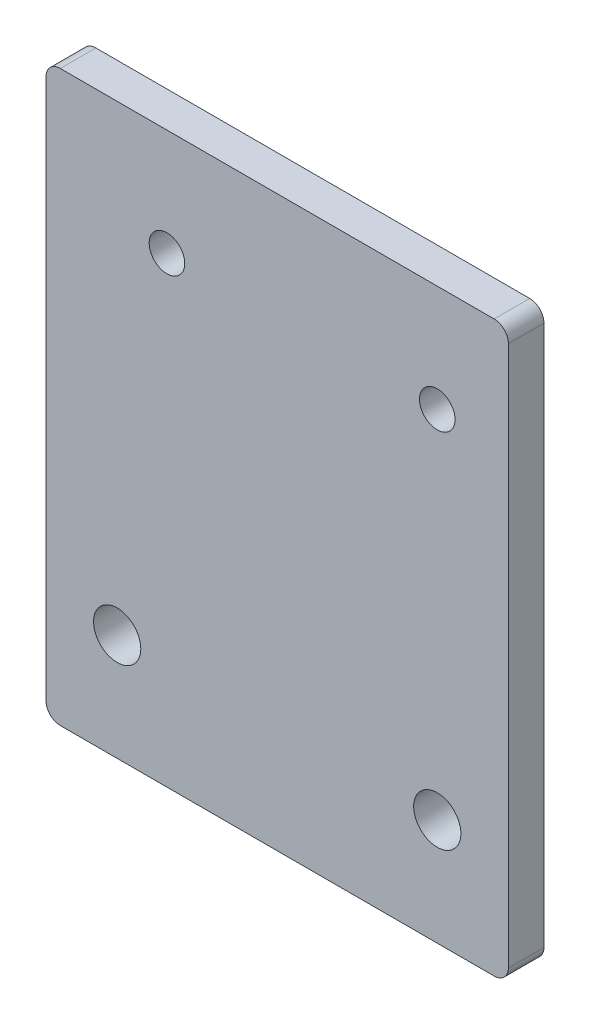
ISO-10303-21;
HEADER;
FILE_DESCRIPTION(('STEP AP214'),'2;1');
FILE_NAME('part.step','',(''),(''),'','','');
FILE_SCHEMA(('AUTOMOTIVE_DESIGN { 1 0 10303 214 1 1 1 1 }'));
ENDSEC;
DATA;
#1=APPLICATION_CONTEXT('core data for automotive mechanical design processes');
#2=APPLICATION_PROTOCOL_DEFINITION('international standard','automotive_design',2000,#1);
#3=PRODUCT_CONTEXT('',#1,'mechanical');
#4=PRODUCT('Part','Part','',(#3));
#5=PRODUCT_RELATED_PRODUCT_CATEGORY('part','',(#4));
#6=PRODUCT_DEFINITION_FORMATION('','',#4);
#7=PRODUCT_DEFINITION_CONTEXT('part definition',#1,'design');
#8=PRODUCT_DEFINITION('design','',#6,#7);
#9=PRODUCT_DEFINITION_SHAPE('','',#8);
#10=(LENGTH_UNIT() NAMED_UNIT(*) SI_UNIT(.MILLI.,.METRE.));
#11=(NAMED_UNIT(*) PLANE_ANGLE_UNIT() SI_UNIT($,.RADIAN.));
#12=(NAMED_UNIT(*) SI_UNIT($,.STERADIAN.) SOLID_ANGLE_UNIT());
#13=UNCERTAINTY_MEASURE_WITH_UNIT(LENGTH_MEASURE(1.E-05),#10,'distance_accuracy_value','');
#14=(GEOMETRIC_REPRESENTATION_CONTEXT(3) GLOBAL_UNCERTAINTY_ASSIGNED_CONTEXT((#13)) GLOBAL_UNIT_ASSIGNED_CONTEXT((#10,
#11,#12)) REPRESENTATION_CONTEXT('',''));
#15=CARTESIAN_POINT('',(0.,0.,0.));
#16=DIRECTION('',(0.,0.,1.));
#17=DIRECTION('',(1.,0.,0.));
#18=AXIS2_PLACEMENT_3D('',#15,#16,#17);
#19=CARTESIAN_POINT('',(41.275,-50.8,3.175));
#20=DIRECTION('',(-1.,0.,0.));
#21=DIRECTION('',(0.,0.,1.));
#22=AXIS2_PLACEMENT_3D('',#19,#20,#21);
#23=PLANE('',#22);
#24=DIRECTION('',(0.,1.,0.));
#25=VECTOR('',#24,1.);
#26=CARTESIAN_POINT('',(41.275,-50.8,3.175));
#27=LINE('',#26,#25);
#28=CARTESIAN_POINT('',(41.275,-48.26,3.175));
#29=VERTEX_POINT('',#28);
#30=CARTESIAN_POINT('',(41.275,48.26,3.175));
#31=VERTEX_POINT('',#30);
#32=EDGE_CURVE('E125',#29,#31,#27,.T.);
#33=ORIENTED_EDGE('',*,*,#32,.F.);
#34=DIRECTION('',(0.,0.,-1.));
#35=VECTOR('',#34,1.);
#36=CARTESIAN_POINT('',(41.275,-48.26,3.175));
#37=LINE('',#36,#35);
#38=CARTESIAN_POINT('',(41.275,-48.26,-3.175));
#39=VERTEX_POINT('',#38);
#40=EDGE_CURVE('E151',#29,#39,#37,.T.);
#41=ORIENTED_EDGE('',*,*,#40,.T.);
#42=DIRECTION('',(0.,1.,0.));
#43=VECTOR('',#42,1.);
#44=CARTESIAN_POINT('',(41.275,-50.8,-3.175));
#45=LINE('',#44,#43);
#46=CARTESIAN_POINT('',(41.275,48.26,-3.175));
#47=VERTEX_POINT('',#46);
#48=EDGE_CURVE('E157',#39,#47,#45,.T.);
#49=ORIENTED_EDGE('',*,*,#48,.T.);
#50=DIRECTION('',(0.,0.,-1.));
#51=VECTOR('',#50,1.);
#52=CARTESIAN_POINT('',(41.275,48.26,3.175));
#53=LINE('',#52,#51);
#54=EDGE_CURVE('E149',#47,#31,#53,.F.);
#55=ORIENTED_EDGE('',*,*,#54,.T.);
#56=EDGE_LOOP('',(#33,#41,#49,#55));
#57=FACE_BOUND('',#56,.T.);
#58=ADVANCED_FACE('F33',(#57),#23,.F.);
#59=CARTESIAN_POINT('',(-41.275,50.8,3.175));
#60=DIRECTION('',(0.,-1.,0.));
#61=DIRECTION('',(0.,0.,-1.));
#62=AXIS2_PLACEMENT_3D('',#59,#60,#61);
#63=PLANE('',#62);
#64=DIRECTION('',(-1.,0.,0.));
#65=VECTOR('',#64,1.);
#66=CARTESIAN_POINT('',(-41.275,50.8,3.175));
#67=LINE('',#66,#65);
#68=CARTESIAN_POINT('',(38.735,50.8,3.175));
#69=VERTEX_POINT('',#68);
#70=CARTESIAN_POINT('',(-38.735,50.8,3.175));
#71=VERTEX_POINT('',#70);
#72=EDGE_CURVE('E128',#69,#71,#67,.T.);
#73=ORIENTED_EDGE('',*,*,#72,.F.);
#74=DIRECTION('',(0.,0.,-1.));
#75=VECTOR('',#74,1.);
#76=CARTESIAN_POINT('',(38.735,50.8,3.175));
#77=LINE('',#76,#75);
#78=CARTESIAN_POINT('',(38.735,50.8,-3.175));
#79=VERTEX_POINT('',#78);
#80=EDGE_CURVE('E11',#69,#79,#77,.T.);
#81=ORIENTED_EDGE('',*,*,#80,.T.);
#82=DIRECTION('',(-1.,0.,0.));
#83=VECTOR('',#82,1.);
#84=CARTESIAN_POINT('',(-41.275,50.8,-3.175));
#85=LINE('',#84,#83);
#86=CARTESIAN_POINT('',(-38.735,50.8,-3.175));
#87=VERTEX_POINT('',#86);
#88=EDGE_CURVE('E130',#79,#87,#85,.T.);
#89=ORIENTED_EDGE('',*,*,#88,.T.);
#90=DIRECTION('',(0.,0.,-1.));
#91=VECTOR('',#90,1.);
#92=CARTESIAN_POINT('',(-38.735,50.8,3.175));
#93=LINE('',#92,#91);
#94=EDGE_CURVE('E41',#87,#71,#93,.F.);
#95=ORIENTED_EDGE('',*,*,#94,.T.);
#96=EDGE_LOOP('',(#73,#81,#89,#95));
#97=FACE_BOUND('',#96,.T.);
#98=ADVANCED_FACE('F218',(#97),#63,.F.);
#99=CARTESIAN_POINT('',(-41.275,-50.8,3.175));
#100=DIRECTION('',(1.,0.,0.));
#101=DIRECTION('',(0.,0.,-1.));
#102=AXIS2_PLACEMENT_3D('',#99,#100,#101);
#103=PLANE('',#102);
#104=DIRECTION('',(0.,-1.,0.));
#105=VECTOR('',#104,1.);
#106=CARTESIAN_POINT('',(-41.275,-50.8,-3.175));
#107=LINE('',#106,#105);
#108=CARTESIAN_POINT('',(-41.275,48.26,-3.175));
#109=VERTEX_POINT('',#108);
#110=CARTESIAN_POINT('',(-41.275,-48.26,-3.175));
#111=VERTEX_POINT('',#110);
#112=EDGE_CURVE('E126',#109,#111,#107,.T.);
#113=ORIENTED_EDGE('',*,*,#112,.T.);
#114=DIRECTION('',(0.,0.,-1.));
#115=VECTOR('',#114,1.);
#116=CARTESIAN_POINT('',(-41.275,-48.26,3.175));
#117=LINE('',#116,#115);
#118=CARTESIAN_POINT('',(-41.275,-48.26,3.175));
#119=VERTEX_POINT('',#118);
#120=EDGE_CURVE('E104',#111,#119,#117,.F.);
#121=ORIENTED_EDGE('',*,*,#120,.T.);
#122=DIRECTION('',(0.,-1.,0.));
#123=VECTOR('',#122,1.);
#124=CARTESIAN_POINT('',(-41.275,-50.8,3.175));
#125=LINE('',#124,#123);
#126=CARTESIAN_POINT('',(-41.275,48.26,3.175));
#127=VERTEX_POINT('',#126);
#128=EDGE_CURVE('E169',#127,#119,#125,.T.);
#129=ORIENTED_EDGE('',*,*,#128,.F.);
#130=DIRECTION('',(0.,0.,-1.));
#131=VECTOR('',#130,1.);
#132=CARTESIAN_POINT('',(-41.275,48.26,3.175));
#133=LINE('',#132,#131);
#134=EDGE_CURVE('E109',#127,#109,#133,.T.);
#135=ORIENTED_EDGE('',*,*,#134,.T.);
#136=EDGE_LOOP('',(#113,#121,#129,#135));
#137=FACE_BOUND('',#136,.T.);
#138=ADVANCED_FACE('F216',(#137),#103,.F.);
#139=CARTESIAN_POINT('',(-41.275,-50.8,3.175));
#140=DIRECTION('',(0.,1.,0.));
#141=DIRECTION('',(0.,0.,1.));
#142=AXIS2_PLACEMENT_3D('',#139,#140,#141);
#143=PLANE('',#142);
#144=DIRECTION('',(1.,0.,0.));
#145=VECTOR('',#144,1.);
#146=CARTESIAN_POINT('',(-41.275,-50.8,3.175));
#147=LINE('',#146,#145);
#148=CARTESIAN_POINT('',(-38.735,-50.8,3.175));
#149=VERTEX_POINT('',#148);
#150=CARTESIAN_POINT('',(38.735,-50.8,3.175));
#151=VERTEX_POINT('',#150);
#152=EDGE_CURVE('E119',#149,#151,#147,.T.);
#153=ORIENTED_EDGE('',*,*,#152,.F.);
#154=DIRECTION('',(0.,0.,-1.));
#155=VECTOR('',#154,1.);
#156=CARTESIAN_POINT('',(-38.735,-50.8,3.175));
#157=LINE('',#156,#155);
#158=CARTESIAN_POINT('',(-38.735,-50.8,-3.175));
#159=VERTEX_POINT('',#158);
#160=EDGE_CURVE('E103',#149,#159,#157,.T.);
#161=ORIENTED_EDGE('',*,*,#160,.T.);
#162=DIRECTION('',(1.,0.,0.));
#163=VECTOR('',#162,1.);
#164=CARTESIAN_POINT('',(-41.275,-50.8,-3.175));
#165=LINE('',#164,#163);
#166=CARTESIAN_POINT('',(38.735,-50.8,-3.175));
#167=VERTEX_POINT('',#166);
#168=EDGE_CURVE('E116',#159,#167,#165,.T.);
#169=ORIENTED_EDGE('',*,*,#168,.T.);
#170=DIRECTION('',(0.,0.,-1.));
#171=VECTOR('',#170,1.);
#172=CARTESIAN_POINT('',(38.735,-50.8,3.175));
#173=LINE('',#172,#171);
#174=EDGE_CURVE('E121',#167,#151,#173,.F.);
#175=ORIENTED_EDGE('',*,*,#174,.T.);
#176=EDGE_LOOP('',(#153,#161,#169,#175));
#177=FACE_BOUND('',#176,.T.);
#178=ADVANCED_FACE('F115',(#177),#143,.F.);
#179=CARTESIAN_POINT('',(0.,0.,3.175));
#180=DIRECTION('',(0.,0.,-1.));
#181=DIRECTION('',(-1.,0.,0.));
#182=AXIS2_PLACEMENT_3D('',#179,#180,#181);
#183=PLANE('',#182);
#184=CARTESIAN_POINT('',(-28.575,-31.75,3.175));
#185=DIRECTION('',(0.,0.,1.));
#186=DIRECTION('',(1.,0.,0.));
#187=AXIS2_PLACEMENT_3D('',#184,#185,#186);
#188=CIRCLE('',#187,4.2164);
#189=CARTESIAN_POINT('',(-24.3586,-31.75,3.175));
#190=VERTEX_POINT('',#189);
#191=EDGE_CURVE('E188',#190,#190,#188,.T.);
#192=ORIENTED_EDGE('',*,*,#191,.F.);
#193=EDGE_LOOP('',(#192));
#194=FACE_BOUND('',#193,.T.);
#195=CARTESIAN_POINT('',(-19.685,31.75,3.175));
#196=DIRECTION('',(0.,0.,1.));
#197=DIRECTION('',(1.,0.,0.));
#198=AXIS2_PLACEMENT_3D('',#195,#196,#197);
#199=CIRCLE('',#198,3.175);
#200=CARTESIAN_POINT('',(-16.51,31.75,3.175));
#201=VERTEX_POINT('',#200);
#202=EDGE_CURVE('E182',#201,#201,#199,.T.);
#203=ORIENTED_EDGE('',*,*,#202,.F.);
#204=EDGE_LOOP('',(#203));
#205=FACE_BOUND('',#204,.T.);
#206=CARTESIAN_POINT('',(28.575,31.75,3.175));
#207=DIRECTION('',(0.,0.,1.));
#208=DIRECTION('',(1.,0.,0.));
#209=AXIS2_PLACEMENT_3D('',#206,#207,#208);
#210=CIRCLE('',#209,3.175);
#211=CARTESIAN_POINT('',(31.75,31.75,3.175));
#212=VERTEX_POINT('',#211);
#213=EDGE_CURVE('E176',#212,#212,#210,.T.);
#214=ORIENTED_EDGE('',*,*,#213,.F.);
#215=EDGE_LOOP('',(#214));
#216=FACE_BOUND('',#215,.T.);
#217=CARTESIAN_POINT('',(28.575,-31.75,3.175));
#218=DIRECTION('',(0.,0.,1.));
#219=DIRECTION('',(1.,0.,0.));
#220=AXIS2_PLACEMENT_3D('',#217,#218,#219);
#221=CIRCLE('',#220,4.2164);
#222=CARTESIAN_POINT('',(32.7914,-31.75,3.175));
#223=VERTEX_POINT('',#222);
#224=EDGE_CURVE('E165',#223,#223,#221,.T.);
#225=ORIENTED_EDGE('',*,*,#224,.F.);
#226=EDGE_LOOP('',(#225));
#227=FACE_BOUND('',#226,.T.);
#228=ORIENTED_EDGE('',*,*,#128,.T.);
#229=CARTESIAN_POINT('',(-38.735,-48.26,3.175));
#230=DIRECTION('',(0.,0.,-1.));
#231=DIRECTION('',(-1.,0.,0.));
#232=AXIS2_PLACEMENT_3D('',#229,#230,#231);
#233=CIRCLE('',#232,2.54);
#234=EDGE_CURVE('E147',#119,#149,#233,.F.);
#235=ORIENTED_EDGE('',*,*,#234,.T.);
#236=ORIENTED_EDGE('',*,*,#152,.T.);
#237=CARTESIAN_POINT('',(38.735,-48.26,3.175));
#238=DIRECTION('',(0.,0.,-1.));
#239=DIRECTION('',(-1.,0.,0.));
#240=AXIS2_PLACEMENT_3D('',#237,#238,#239);
#241=CIRCLE('',#240,2.54);
#242=EDGE_CURVE('E145',#151,#29,#241,.F.);
#243=ORIENTED_EDGE('',*,*,#242,.T.);
#244=ORIENTED_EDGE('',*,*,#32,.T.);
#245=CARTESIAN_POINT('',(38.735,48.26,3.175));
#246=DIRECTION('',(0.,0.,-1.));
#247=DIRECTION('',(-1.,0.,0.));
#248=AXIS2_PLACEMENT_3D('',#245,#246,#247);
#249=CIRCLE('',#248,2.54);
#250=EDGE_CURVE('E54',#31,#69,#249,.F.);
#251=ORIENTED_EDGE('',*,*,#250,.T.);
#252=ORIENTED_EDGE('',*,*,#72,.T.);
#253=CARTESIAN_POINT('',(-38.735,48.26,3.175));
#254=DIRECTION('',(0.,0.,-1.));
#255=DIRECTION('',(-1.,0.,0.));
#256=AXIS2_PLACEMENT_3D('',#253,#254,#255);
#257=CIRCLE('',#256,2.54);
#258=EDGE_CURVE('E142',#71,#127,#257,.F.);
#259=ORIENTED_EDGE('',*,*,#258,.T.);
#260=EDGE_LOOP('',(#228,#235,#236,#243,#244,#251,#252,#259));
#261=FACE_BOUND('',#260,.T.);
#262=ADVANCED_FACE('F203',(#194,#205,#216,#227,#261),#183,.F.);
#263=CARTESIAN_POINT('',(0.,0.,-3.175));
#264=DIRECTION('',(0.,0.,-1.));
#265=DIRECTION('',(-1.,0.,0.));
#266=AXIS2_PLACEMENT_3D('',#263,#264,#265);
#267=PLANE('',#266);
#268=CARTESIAN_POINT('',(-28.575,-31.75,-3.175));
#269=DIRECTION('',(0.,0.,1.));
#270=DIRECTION('',(1.,0.,0.));
#271=AXIS2_PLACEMENT_3D('',#268,#269,#270);
#272=CIRCLE('',#271,4.2164);
#273=CARTESIAN_POINT('',(-24.3586,-31.75,-3.175));
#274=VERTEX_POINT('',#273);
#275=EDGE_CURVE('E174',#274,#274,#272,.T.);
#276=ORIENTED_EDGE('',*,*,#275,.T.);
#277=EDGE_LOOP('',(#276));
#278=FACE_BOUND('',#277,.T.);
#279=CARTESIAN_POINT('',(-19.685,31.75,-3.175));
#280=DIRECTION('',(0.,0.,1.));
#281=DIRECTION('',(1.,0.,0.));
#282=AXIS2_PLACEMENT_3D('',#279,#280,#281);
#283=CIRCLE('',#282,3.175);
#284=CARTESIAN_POINT('',(-16.51,31.75,-3.175));
#285=VERTEX_POINT('',#284);
#286=EDGE_CURVE('E185',#285,#285,#283,.T.);
#287=ORIENTED_EDGE('',*,*,#286,.T.);
#288=EDGE_LOOP('',(#287));
#289=FACE_BOUND('',#288,.T.);
#290=CARTESIAN_POINT('',(28.575,31.75,-3.175));
#291=DIRECTION('',(0.,0.,1.));
#292=DIRECTION('',(1.,0.,0.));
#293=AXIS2_PLACEMENT_3D('',#290,#291,#292);
#294=CIRCLE('',#293,3.175);
#295=CARTESIAN_POINT('',(31.75,31.75,-3.175));
#296=VERTEX_POINT('',#295);
#297=EDGE_CURVE('E179',#296,#296,#294,.T.);
#298=ORIENTED_EDGE('',*,*,#297,.T.);
#299=EDGE_LOOP('',(#298));
#300=FACE_BOUND('',#299,.T.);
#301=CARTESIAN_POINT('',(28.575,-31.75,-3.175));
#302=DIRECTION('',(0.,0.,1.));
#303=DIRECTION('',(1.,0.,0.));
#304=AXIS2_PLACEMENT_3D('',#301,#302,#303);
#305=CIRCLE('',#304,4.2164);
#306=CARTESIAN_POINT('',(32.7914,-31.75,-3.175));
#307=VERTEX_POINT('',#306);
#308=EDGE_CURVE('E162',#307,#307,#305,.T.);
#309=ORIENTED_EDGE('',*,*,#308,.T.);
#310=EDGE_LOOP('',(#309));
#311=FACE_BOUND('',#310,.T.);
#312=ORIENTED_EDGE('',*,*,#168,.F.);
#313=CARTESIAN_POINT('',(-38.735,-48.26,-3.175));
#314=DIRECTION('',(0.,0.,-1.));
#315=DIRECTION('',(-1.,0.,0.));
#316=AXIS2_PLACEMENT_3D('',#313,#314,#315);
#317=CIRCLE('',#316,2.54);
#318=EDGE_CURVE('E99',#159,#111,#317,.T.);
#319=ORIENTED_EDGE('',*,*,#318,.T.);
#320=ORIENTED_EDGE('',*,*,#112,.F.);
#321=CARTESIAN_POINT('',(-38.735,48.26,-3.175));
#322=DIRECTION('',(0.,0.,-1.));
#323=DIRECTION('',(-1.,0.,0.));
#324=AXIS2_PLACEMENT_3D('',#321,#322,#323);
#325=CIRCLE('',#324,2.54);
#326=EDGE_CURVE('E120',#109,#87,#325,.T.);
#327=ORIENTED_EDGE('',*,*,#326,.T.);
#328=ORIENTED_EDGE('',*,*,#88,.F.);
#329=CARTESIAN_POINT('',(38.735,48.26,-3.175));
#330=DIRECTION('',(0.,0.,-1.));
#331=DIRECTION('',(-1.,0.,0.));
#332=AXIS2_PLACEMENT_3D('',#329,#330,#331);
#333=CIRCLE('',#332,2.54);
#334=EDGE_CURVE('E136',#79,#47,#333,.T.);
#335=ORIENTED_EDGE('',*,*,#334,.T.);
#336=ORIENTED_EDGE('',*,*,#48,.F.);
#337=CARTESIAN_POINT('',(38.735,-48.26,-3.175));
#338=DIRECTION('',(0.,0.,-1.));
#339=DIRECTION('',(-1.,0.,0.));
#340=AXIS2_PLACEMENT_3D('',#337,#338,#339);
#341=CIRCLE('',#340,2.54);
#342=EDGE_CURVE('E110',#39,#167,#341,.T.);
#343=ORIENTED_EDGE('',*,*,#342,.T.);
#344=EDGE_LOOP('',(#312,#319,#320,#327,#328,#335,#336,#343));
#345=FACE_BOUND('',#344,.T.);
#346=ADVANCED_FACE('F123',(#278,#289,#300,#311,#345),#267,.T.);
#347=CARTESIAN_POINT('',(28.575,-31.75,-3.175));
#348=DIRECTION('',(0.,0.,1.));
#349=DIRECTION('',(1.,0.,0.));
#350=AXIS2_PLACEMENT_3D('',#347,#348,#349);
#351=CYLINDRICAL_SURFACE('',#350,4.2164);
#352=ORIENTED_EDGE('',*,*,#308,.F.);
#353=EDGE_LOOP('',(#352));
#354=FACE_BOUND('',#353,.T.);
#355=ORIENTED_EDGE('',*,*,#224,.T.);
#356=EDGE_LOOP('',(#355));
#357=FACE_BOUND('',#356,.T.);
#358=ADVANCED_FACE('F242',(#354,#357),#351,.F.);
#359=CARTESIAN_POINT('',(28.575,31.75,-3.175));
#360=DIRECTION('',(0.,0.,1.));
#361=DIRECTION('',(1.,0.,0.));
#362=AXIS2_PLACEMENT_3D('',#359,#360,#361);
#363=CYLINDRICAL_SURFACE('',#362,3.175);
#364=ORIENTED_EDGE('',*,*,#297,.F.);
#365=EDGE_LOOP('',(#364));
#366=FACE_BOUND('',#365,.T.);
#367=ORIENTED_EDGE('',*,*,#213,.T.);
#368=EDGE_LOOP('',(#367));
#369=FACE_BOUND('',#368,.T.);
#370=ADVANCED_FACE('F246',(#366,#369),#363,.F.);
#371=CARTESIAN_POINT('',(-19.685,31.75,-3.175));
#372=DIRECTION('',(0.,0.,1.));
#373=DIRECTION('',(1.,0.,0.));
#374=AXIS2_PLACEMENT_3D('',#371,#372,#373);
#375=CYLINDRICAL_SURFACE('',#374,3.175);
#376=ORIENTED_EDGE('',*,*,#286,.F.);
#377=EDGE_LOOP('',(#376));
#378=FACE_BOUND('',#377,.T.);
#379=ORIENTED_EDGE('',*,*,#202,.T.);
#380=EDGE_LOOP('',(#379));
#381=FACE_BOUND('',#380,.T.);
#382=ADVANCED_FACE('F199',(#378,#381),#375,.F.);
#383=CARTESIAN_POINT('',(-28.575,-31.75,-3.175));
#384=DIRECTION('',(0.,0.,1.));
#385=DIRECTION('',(1.,0.,0.));
#386=AXIS2_PLACEMENT_3D('',#383,#384,#385);
#387=CYLINDRICAL_SURFACE('',#386,4.2164);
#388=ORIENTED_EDGE('',*,*,#275,.F.);
#389=EDGE_LOOP('',(#388));
#390=FACE_BOUND('',#389,.T.);
#391=ORIENTED_EDGE('',*,*,#191,.T.);
#392=EDGE_LOOP('',(#391));
#393=FACE_BOUND('',#392,.T.);
#394=ADVANCED_FACE('F196',(#390,#393),#387,.F.);
#395=CARTESIAN_POINT('',(-38.735,-48.26,3.175));
#396=DIRECTION('',(0.,0.,-1.));
#397=DIRECTION('',(-1.,0.,0.));
#398=AXIS2_PLACEMENT_3D('',#395,#396,#397);
#399=CYLINDRICAL_SURFACE('',#398,2.54);
#400=ORIENTED_EDGE('',*,*,#234,.F.);
#401=ORIENTED_EDGE('',*,*,#120,.F.);
#402=ORIENTED_EDGE('',*,*,#318,.F.);
#403=ORIENTED_EDGE('',*,*,#160,.F.);
#404=EDGE_LOOP('',(#400,#401,#402,#403));
#405=FACE_BOUND('',#404,.T.);
#406=ADVANCED_FACE('F102',(#405),#399,.T.);
#407=CARTESIAN_POINT('',(38.735,-48.26,3.175));
#408=DIRECTION('',(0.,0.,-1.));
#409=DIRECTION('',(-1.,0.,0.));
#410=AXIS2_PLACEMENT_3D('',#407,#408,#409);
#411=CYLINDRICAL_SURFACE('',#410,2.54);
#412=ORIENTED_EDGE('',*,*,#242,.F.);
#413=ORIENTED_EDGE('',*,*,#174,.F.);
#414=ORIENTED_EDGE('',*,*,#342,.F.);
#415=ORIENTED_EDGE('',*,*,#40,.F.);
#416=EDGE_LOOP('',(#412,#413,#414,#415));
#417=FACE_BOUND('',#416,.T.);
#418=ADVANCED_FACE('F222',(#417),#411,.T.);
#419=CARTESIAN_POINT('',(38.735,48.26,3.175));
#420=DIRECTION('',(0.,0.,-1.));
#421=DIRECTION('',(-1.,0.,0.));
#422=AXIS2_PLACEMENT_3D('',#419,#420,#421);
#423=CYLINDRICAL_SURFACE('',#422,2.54);
#424=ORIENTED_EDGE('',*,*,#250,.F.);
#425=ORIENTED_EDGE('',*,*,#54,.F.);
#426=ORIENTED_EDGE('',*,*,#334,.F.);
#427=ORIENTED_EDGE('',*,*,#80,.F.);
#428=EDGE_LOOP('',(#424,#425,#426,#427));
#429=FACE_BOUND('',#428,.T.);
#430=ADVANCED_FACE('F221',(#429),#423,.T.);
#431=CARTESIAN_POINT('',(-38.735,48.26,3.175));
#432=DIRECTION('',(0.,0.,-1.));
#433=DIRECTION('',(-1.,0.,0.));
#434=AXIS2_PLACEMENT_3D('',#431,#432,#433);
#435=CYLINDRICAL_SURFACE('',#434,2.54);
#436=ORIENTED_EDGE('',*,*,#258,.F.);
#437=ORIENTED_EDGE('',*,*,#94,.F.);
#438=ORIENTED_EDGE('',*,*,#326,.F.);
#439=ORIENTED_EDGE('',*,*,#134,.F.);
#440=EDGE_LOOP('',(#436,#437,#438,#439));
#441=FACE_BOUND('',#440,.T.);
#442=ADVANCED_FACE('F35',(#441),#435,.T.);
#443=CLOSED_SHELL('',(#58,#98,#138,#178,#262,#346,#358,#370,#382,#394,#406,#418,#430,#442));
#444=MANIFOLD_SOLID_BREP('B2',#443);
#445=ADVANCED_BREP_SHAPE_REPRESENTATION('',(#18,#444),#14);
#446=SHAPE_DEFINITION_REPRESENTATION(#9,#445);
ENDSEC;
END-ISO-10303-21;
